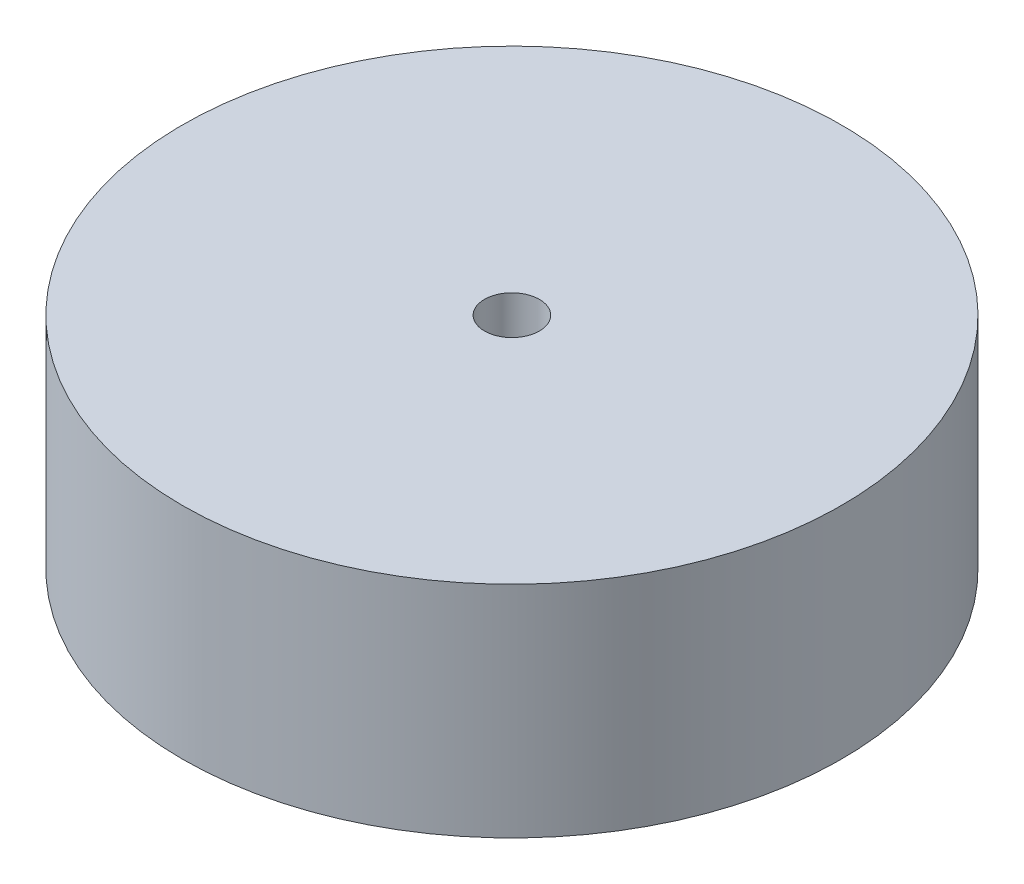
ISO-10303-21;
HEADER;
FILE_DESCRIPTION(('STEP AP214'),'2;1');
FILE_NAME('part.step','',(''),(''),'','','');
FILE_SCHEMA(('AUTOMOTIVE_DESIGN { 1 0 10303 214 1 1 1 1 }'));
ENDSEC;
DATA;
#1=APPLICATION_CONTEXT('core data for automotive mechanical design processes');
#2=APPLICATION_PROTOCOL_DEFINITION('international standard','automotive_design',2000,#1);
#3=PRODUCT_CONTEXT('',#1,'mechanical');
#4=PRODUCT('Part','Part','',(#3));
#5=PRODUCT_RELATED_PRODUCT_CATEGORY('part','',(#4));
#6=PRODUCT_DEFINITION_FORMATION('','',#4);
#7=PRODUCT_DEFINITION_CONTEXT('part definition',#1,'design');
#8=PRODUCT_DEFINITION('design','',#6,#7);
#9=PRODUCT_DEFINITION_SHAPE('','',#8);
#10=(LENGTH_UNIT() NAMED_UNIT(*) SI_UNIT(.MILLI.,.METRE.));
#11=(NAMED_UNIT(*) PLANE_ANGLE_UNIT() SI_UNIT($,.RADIAN.));
#12=(NAMED_UNIT(*) SI_UNIT($,.STERADIAN.) SOLID_ANGLE_UNIT());
#13=UNCERTAINTY_MEASURE_WITH_UNIT(LENGTH_MEASURE(1.E-05),#10,'distance_accuracy_value','');
#14=(GEOMETRIC_REPRESENTATION_CONTEXT(3) GLOBAL_UNCERTAINTY_ASSIGNED_CONTEXT((#13)) GLOBAL_UNIT_ASSIGNED_CONTEXT((#10,
#11,#12)) REPRESENTATION_CONTEXT('',''));
#15=CARTESIAN_POINT('',(0.,0.,0.));
#16=DIRECTION('',(0.,0.,1.));
#17=DIRECTION('',(1.,0.,0.));
#18=AXIS2_PLACEMENT_3D('',#15,#16,#17);
#19=CARTESIAN_POINT('',(0.,12.7,0.));
#20=DIRECTION('',(0.,1.,0.));
#21=DIRECTION('',(0.,0.,1.));
#22=AXIS2_PLACEMENT_3D('',#19,#20,#21);
#23=PLANE('',#22);
#24=CARTESIAN_POINT('',(0.,12.7,0.));
#25=DIRECTION('',(0.,1.,0.));
#26=DIRECTION('',(0.,0.,1.));
#27=AXIS2_PLACEMENT_3D('',#24,#25,#26);
#28=CIRCLE('',#27,19.05);
#29=CARTESIAN_POINT('',(0.,12.7,19.05));
#30=VERTEX_POINT('',#29);
#31=EDGE_CURVE('E10',#30,#30,#28,.T.);
#32=ORIENTED_EDGE('',*,*,#31,.T.);
#33=EDGE_LOOP('',(#32));
#34=FACE_BOUND('',#33,.T.);
#35=CARTESIAN_POINT('',(0.,12.7,0.));
#36=DIRECTION('',(0.,1.,0.));
#37=DIRECTION('',(0.,0.,1.));
#38=AXIS2_PLACEMENT_3D('',#35,#36,#37);
#39=CIRCLE('',#38,1.5875);
#40=CARTESIAN_POINT('',(0.,12.7,1.5875));
#41=VERTEX_POINT('',#40);
#42=EDGE_CURVE('E42',#41,#41,#39,.T.);
#43=ORIENTED_EDGE('',*,*,#42,.F.);
#44=EDGE_LOOP('',(#43));
#45=FACE_BOUND('',#44,.T.);
#46=ADVANCED_FACE('F31',(#34,#45),#23,.T.);
#47=CARTESIAN_POINT('',(0.,0.,0.));
#48=DIRECTION('',(0.,1.,0.));
#49=DIRECTION('',(0.,0.,1.));
#50=AXIS2_PLACEMENT_3D('',#47,#48,#49);
#51=PLANE('',#50);
#52=CARTESIAN_POINT('',(0.,0.,0.));
#53=DIRECTION('',(0.,1.,0.));
#54=DIRECTION('',(0.,0.,1.));
#55=AXIS2_PLACEMENT_3D('',#52,#53,#54);
#56=CIRCLE('',#55,19.05);
#57=CARTESIAN_POINT('',(0.,0.,19.05));
#58=VERTEX_POINT('',#57);
#59=EDGE_CURVE('E35',#58,#58,#56,.T.);
#60=ORIENTED_EDGE('',*,*,#59,.F.);
#61=EDGE_LOOP('',(#60));
#62=FACE_BOUND('',#61,.T.);
#63=CARTESIAN_POINT('',(0.,0.,0.));
#64=DIRECTION('',(0.,1.,0.));
#65=DIRECTION('',(0.,0.,1.));
#66=AXIS2_PLACEMENT_3D('',#63,#64,#65);
#67=CIRCLE('',#66,1.5875);
#68=CARTESIAN_POINT('',(0.,0.,1.5875));
#69=VERTEX_POINT('',#68);
#70=EDGE_CURVE('E44',#69,#69,#67,.T.);
#71=ORIENTED_EDGE('',*,*,#70,.T.);
#72=EDGE_LOOP('',(#71));
#73=FACE_BOUND('',#72,.T.);
#74=ADVANCED_FACE('F54',(#62,#73),#51,.F.);
#75=CARTESIAN_POINT('',(0.,12.7,0.));
#76=DIRECTION('',(0.,-1.,0.));
#77=DIRECTION('',(0.,0.,-1.));
#78=AXIS2_PLACEMENT_3D('',#75,#76,#77);
#79=CYLINDRICAL_SURFACE('',#78,19.05);
#80=ORIENTED_EDGE('',*,*,#31,.F.);
#81=EDGE_LOOP('',(#80));
#82=FACE_BOUND('',#81,.T.);
#83=ORIENTED_EDGE('',*,*,#59,.T.);
#84=EDGE_LOOP('',(#83));
#85=FACE_BOUND('',#84,.T.);
#86=ADVANCED_FACE('F33',(#82,#85),#79,.T.);
#87=CARTESIAN_POINT('',(0.,12.7,0.));
#88=DIRECTION('',(0.,-1.,0.));
#89=DIRECTION('',(0.,0.,-1.));
#90=AXIS2_PLACEMENT_3D('',#87,#88,#89);
#91=CYLINDRICAL_SURFACE('',#90,1.5875);
#92=ORIENTED_EDGE('',*,*,#42,.T.);
#93=EDGE_LOOP('',(#92));
#94=FACE_BOUND('',#93,.T.);
#95=ORIENTED_EDGE('',*,*,#70,.F.);
#96=EDGE_LOOP('',(#95));
#97=FACE_BOUND('',#96,.T.);
#98=ADVANCED_FACE('F50',(#94,#97),#91,.F.);
#99=CLOSED_SHELL('',(#46,#74,#86,#98));
#100=MANIFOLD_SOLID_BREP('B2',#99);
#101=ADVANCED_BREP_SHAPE_REPRESENTATION('',(#18,#100),#14);
#102=SHAPE_DEFINITION_REPRESENTATION(#9,#101);
ENDSEC;
END-ISO-10303-21;
